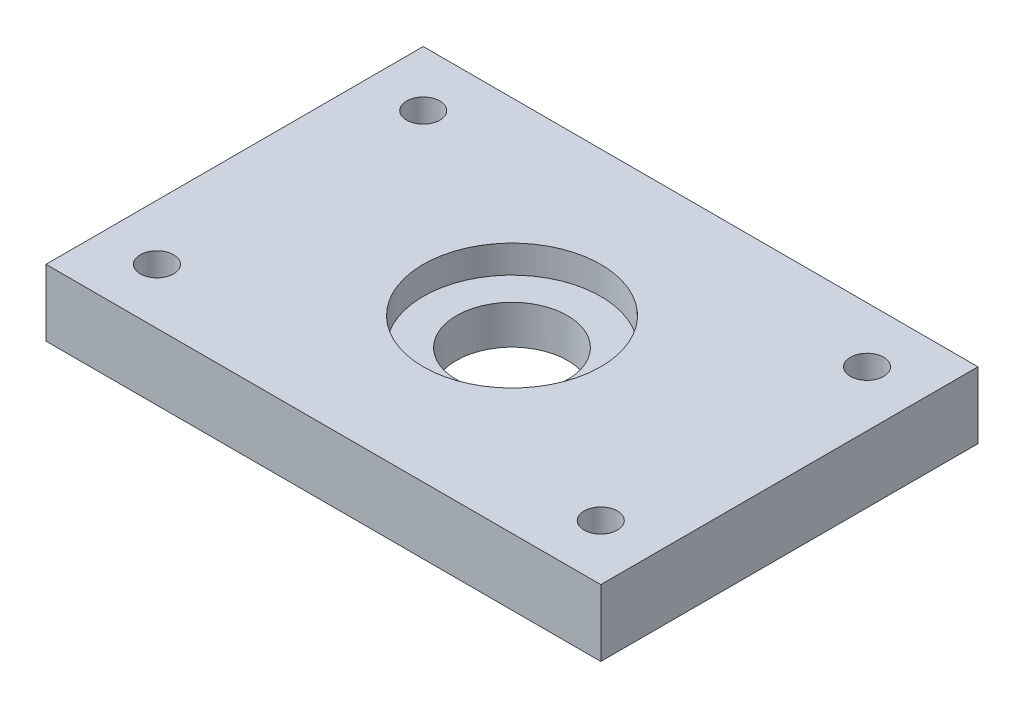
ISO-10303-21;
HEADER;
FILE_DESCRIPTION(('STEP AP214'),'2;1');
FILE_NAME('part.step','',(''),(''),'','','');
FILE_SCHEMA(('AUTOMOTIVE_DESIGN { 1 0 10303 214 1 1 1 1 }'));
ENDSEC;
DATA;
#1=APPLICATION_CONTEXT('core data for automotive mechanical design processes');
#2=APPLICATION_PROTOCOL_DEFINITION('international standard','automotive_design',2000,#1);
#3=PRODUCT_CONTEXT('',#1,'mechanical');
#4=PRODUCT('Part','Part','',(#3));
#5=PRODUCT_RELATED_PRODUCT_CATEGORY('part','',(#4));
#6=PRODUCT_DEFINITION_FORMATION('','',#4);
#7=PRODUCT_DEFINITION_CONTEXT('part definition',#1,'design');
#8=PRODUCT_DEFINITION('design','',#6,#7);
#9=PRODUCT_DEFINITION_SHAPE('','',#8);
#10=(LENGTH_UNIT() NAMED_UNIT(*) SI_UNIT(.MILLI.,.METRE.));
#11=(NAMED_UNIT(*) PLANE_ANGLE_UNIT() SI_UNIT($,.RADIAN.));
#12=(NAMED_UNIT(*) SI_UNIT($,.STERADIAN.) SOLID_ANGLE_UNIT());
#13=UNCERTAINTY_MEASURE_WITH_UNIT(LENGTH_MEASURE(1.E-05),#10,'distance_accuracy_value','');
#14=(GEOMETRIC_REPRESENTATION_CONTEXT(3) GLOBAL_UNCERTAINTY_ASSIGNED_CONTEXT((#13)) GLOBAL_UNIT_ASSIGNED_CONTEXT((#10,
#11,#12)) REPRESENTATION_CONTEXT('',''));
#15=CARTESIAN_POINT('',(0.,0.,0.));
#16=DIRECTION('',(0.,0.,1.));
#17=DIRECTION('',(1.,0.,0.));
#18=AXIS2_PLACEMENT_3D('',#15,#16,#17);
#19=CARTESIAN_POINT('',(0.,-14.142135623731,0.));
#20=DIRECTION('',(0.,1.,0.));
#21=DIRECTION('',(0.,0.,1.));
#22=AXIS2_PLACEMENT_3D('',#19,#20,#21);
#23=CYLINDRICAL_SURFACE('',#22,5.);
#24=CARTESIAN_POINT('',(0.,0.,0.));
#25=DIRECTION('',(0.,-1.,0.));
#26=DIRECTION('',(0.,0.,-1.));
#27=AXIS2_PLACEMENT_3D('',#24,#25,#26);
#28=CIRCLE('',#27,5.);
#29=CARTESIAN_POINT('',(0.,0.,-5.));
#30=VERTEX_POINT('',#29);
#31=EDGE_CURVE('E138',#30,#30,#28,.F.);
#32=ORIENTED_EDGE('',*,*,#31,.F.);
#33=EDGE_LOOP('',(#32));
#34=FACE_BOUND('',#33,.T.);
#35=CARTESIAN_POINT('',(0.,3.5,0.));
#36=DIRECTION('',(0.,1.,0.));
#37=DIRECTION('',(0.,0.,1.));
#38=AXIS2_PLACEMENT_3D('',#35,#36,#37);
#39=CIRCLE('',#38,5.);
#40=CARTESIAN_POINT('',(0.,3.5,5.));
#41=VERTEX_POINT('',#40);
#42=EDGE_CURVE('E39',#41,#41,#39,.F.);
#43=ORIENTED_EDGE('',*,*,#42,.F.);
#44=EDGE_LOOP('',(#43));
#45=FACE_BOUND('',#44,.T.);
#46=ADVANCED_FACE('F35',(#34,#45),#23,.F.);
#47=CARTESIAN_POINT('',(25.,6.,-17.));
#48=DIRECTION('',(-1.,0.,0.));
#49=DIRECTION('',(0.,0.,1.));
#50=AXIS2_PLACEMENT_3D('',#47,#48,#49);
#51=PLANE('',#50);
#52=DIRECTION('',(0.,0.,-1.));
#53=VECTOR('',#52,1.);
#54=CARTESIAN_POINT('',(25.,0.,-17.));
#55=LINE('',#54,#53);
#56=CARTESIAN_POINT('',(25.,0.,17.));
#57=VERTEX_POINT('',#56);
#58=CARTESIAN_POINT('',(25.,0.,-17.));
#59=VERTEX_POINT('',#58);
#60=EDGE_CURVE('E101',#57,#59,#55,.T.);
#61=ORIENTED_EDGE('',*,*,#60,.T.);
#62=DIRECTION('',(0.,-1.,0.));
#63=VECTOR('',#62,1.);
#64=CARTESIAN_POINT('',(25.,6.,-17.));
#65=LINE('',#64,#63);
#66=CARTESIAN_POINT('',(25.,6.,-17.));
#67=VERTEX_POINT('',#66);
#68=EDGE_CURVE('E11',#67,#59,#65,.T.);
#69=ORIENTED_EDGE('',*,*,#68,.F.);
#70=DIRECTION('',(0.,0.,-1.));
#71=VECTOR('',#70,1.);
#72=CARTESIAN_POINT('',(25.,6.,-17.));
#73=LINE('',#72,#71);
#74=CARTESIAN_POINT('',(25.,6.,17.));
#75=VERTEX_POINT('',#74);
#76=EDGE_CURVE('E88',#75,#67,#73,.T.);
#77=ORIENTED_EDGE('',*,*,#76,.F.);
#78=DIRECTION('',(0.,-1.,0.));
#79=VECTOR('',#78,1.);
#80=CARTESIAN_POINT('',(25.,6.,17.));
#81=LINE('',#80,#79);
#82=EDGE_CURVE('E97',#75,#57,#81,.T.);
#83=ORIENTED_EDGE('',*,*,#82,.T.);
#84=EDGE_LOOP('',(#61,#69,#77,#83));
#85=FACE_BOUND('',#84,.T.);
#86=ADVANCED_FACE('F37',(#85),#51,.F.);
#87=CARTESIAN_POINT('',(25.,6.,-17.));
#88=DIRECTION('',(0.,0.,1.));
#89=DIRECTION('',(1.,0.,0.));
#90=AXIS2_PLACEMENT_3D('',#87,#88,#89);
#91=PLANE('',#90);
#92=DIRECTION('',(-1.,0.,0.));
#93=VECTOR('',#92,1.);
#94=CARTESIAN_POINT('',(25.,0.,-17.));
#95=LINE('',#94,#93);
#96=CARTESIAN_POINT('',(-25.,0.,-17.));
#97=VERTEX_POINT('',#96);
#98=EDGE_CURVE('E92',#59,#97,#95,.T.);
#99=ORIENTED_EDGE('',*,*,#98,.T.);
#100=DIRECTION('',(0.,-1.,0.));
#101=VECTOR('',#100,1.);
#102=CARTESIAN_POINT('',(-25.,6.,-17.));
#103=LINE('',#102,#101);
#104=CARTESIAN_POINT('',(-25.,6.,-17.));
#105=VERTEX_POINT('',#104);
#106=EDGE_CURVE('E45',#105,#97,#103,.T.);
#107=ORIENTED_EDGE('',*,*,#106,.F.);
#108=DIRECTION('',(-1.,0.,0.));
#109=VECTOR('',#108,1.);
#110=CARTESIAN_POINT('',(25.,6.,-17.));
#111=LINE('',#110,#109);
#112=EDGE_CURVE('E83',#67,#105,#111,.T.);
#113=ORIENTED_EDGE('',*,*,#112,.F.);
#114=ORIENTED_EDGE('',*,*,#68,.T.);
#115=EDGE_LOOP('',(#99,#107,#113,#114));
#116=FACE_BOUND('',#115,.T.);
#117=ADVANCED_FACE('F91',(#116),#91,.F.);
#118=CARTESIAN_POINT('',(-25.,6.,-17.));
#119=DIRECTION('',(1.,0.,0.));
#120=DIRECTION('',(0.,0.,-1.));
#121=AXIS2_PLACEMENT_3D('',#118,#119,#120);
#122=PLANE('',#121);
#123=DIRECTION('',(0.,0.,1.));
#124=VECTOR('',#123,1.);
#125=CARTESIAN_POINT('',(-25.,0.,-17.));
#126=LINE('',#125,#124);
#127=CARTESIAN_POINT('',(-25.,0.,17.));
#128=VERTEX_POINT('',#127);
#129=EDGE_CURVE('E70',#97,#128,#126,.T.);
#130=ORIENTED_EDGE('',*,*,#129,.T.);
#131=DIRECTION('',(0.,-1.,0.));
#132=VECTOR('',#131,1.);
#133=CARTESIAN_POINT('',(-25.,6.,17.));
#134=LINE('',#133,#132);
#135=CARTESIAN_POINT('',(-25.,6.,17.));
#136=VERTEX_POINT('',#135);
#137=EDGE_CURVE('E93',#136,#128,#134,.T.);
#138=ORIENTED_EDGE('',*,*,#137,.F.);
#139=DIRECTION('',(0.,0.,1.));
#140=VECTOR('',#139,1.);
#141=CARTESIAN_POINT('',(-25.,6.,-17.));
#142=LINE('',#141,#140);
#143=EDGE_CURVE('E86',#105,#136,#142,.T.);
#144=ORIENTED_EDGE('',*,*,#143,.F.);
#145=ORIENTED_EDGE('',*,*,#106,.T.);
#146=EDGE_LOOP('',(#130,#138,#144,#145));
#147=FACE_BOUND('',#146,.T.);
#148=ADVANCED_FACE('F95',(#147),#122,.F.);
#149=CARTESIAN_POINT('',(25.,6.,17.));
#150=DIRECTION('',(0.,0.,-1.));
#151=DIRECTION('',(-1.,0.,0.));
#152=AXIS2_PLACEMENT_3D('',#149,#150,#151);
#153=PLANE('',#152);
#154=DIRECTION('',(1.,0.,0.));
#155=VECTOR('',#154,1.);
#156=CARTESIAN_POINT('',(25.,0.,17.));
#157=LINE('',#156,#155);
#158=EDGE_CURVE('E76',#128,#57,#157,.T.);
#159=ORIENTED_EDGE('',*,*,#158,.T.);
#160=ORIENTED_EDGE('',*,*,#82,.F.);
#161=DIRECTION('',(1.,0.,0.));
#162=VECTOR('',#161,1.);
#163=CARTESIAN_POINT('',(25.,6.,17.));
#164=LINE('',#163,#162);
#165=EDGE_CURVE('E53',#136,#75,#164,.T.);
#166=ORIENTED_EDGE('',*,*,#165,.F.);
#167=ORIENTED_EDGE('',*,*,#137,.T.);
#168=EDGE_LOOP('',(#159,#160,#166,#167));
#169=FACE_BOUND('',#168,.T.);
#170=ADVANCED_FACE('F109',(#169),#153,.F.);
#171=CARTESIAN_POINT('',(0.,6.,0.));
#172=DIRECTION('',(0.,-1.,0.));
#173=DIRECTION('',(0.,0.,-1.));
#174=AXIS2_PLACEMENT_3D('',#171,#172,#173);
#175=PLANE('',#174);
#176=CARTESIAN_POINT('',(0.,6.,0.));
#177=DIRECTION('',(0.,1.,0.));
#178=DIRECTION('',(0.,0.,1.));
#179=AXIS2_PLACEMENT_3D('',#176,#177,#178);
#180=CIRCLE('',#179,8.);
#181=CARTESIAN_POINT('',(0.,6.,8.));
#182=VERTEX_POINT('',#181);
#183=EDGE_CURVE('E141',#182,#182,#180,.T.);
#184=ORIENTED_EDGE('',*,*,#183,.F.);
#185=EDGE_LOOP('',(#184));
#186=FACE_BOUND('',#185,.T.);
#187=CARTESIAN_POINT('',(20.,6.,-12.));
#188=DIRECTION('',(0.,-1.,0.));
#189=DIRECTION('',(0.,0.,-1.));
#190=AXIS2_PLACEMENT_3D('',#187,#188,#189);
#191=CIRCLE('',#190,1.5);
#192=CARTESIAN_POINT('',(20.,6.,-13.5));
#193=VERTEX_POINT('',#192);
#194=EDGE_CURVE('E132',#193,#193,#191,.F.);
#195=ORIENTED_EDGE('',*,*,#194,.F.);
#196=EDGE_LOOP('',(#195));
#197=FACE_BOUND('',#196,.T.);
#198=CARTESIAN_POINT('',(-20.,6.,-12.));
#199=DIRECTION('',(0.,-1.,0.));
#200=DIRECTION('',(0.,0.,-1.));
#201=AXIS2_PLACEMENT_3D('',#198,#199,#200);
#202=CIRCLE('',#201,1.5);
#203=CARTESIAN_POINT('',(-20.,6.,-13.5));
#204=VERTEX_POINT('',#203);
#205=EDGE_CURVE('E126',#204,#204,#202,.F.);
#206=ORIENTED_EDGE('',*,*,#205,.F.);
#207=EDGE_LOOP('',(#206));
#208=FACE_BOUND('',#207,.T.);
#209=CARTESIAN_POINT('',(-20.,6.,12.));
#210=DIRECTION('',(0.,-1.,0.));
#211=DIRECTION('',(0.,0.,-1.));
#212=AXIS2_PLACEMENT_3D('',#209,#210,#211);
#213=CIRCLE('',#212,1.5);
#214=CARTESIAN_POINT('',(-20.,6.,10.5));
#215=VERTEX_POINT('',#214);
#216=EDGE_CURVE('E120',#215,#215,#213,.F.);
#217=ORIENTED_EDGE('',*,*,#216,.F.);
#218=EDGE_LOOP('',(#217));
#219=FACE_BOUND('',#218,.T.);
#220=CARTESIAN_POINT('',(20.,6.,12.));
#221=DIRECTION('',(0.,-1.,0.));
#222=DIRECTION('',(0.,0.,-1.));
#223=AXIS2_PLACEMENT_3D('',#220,#221,#222);
#224=CIRCLE('',#223,1.5);
#225=CARTESIAN_POINT('',(20.,6.,10.5));
#226=VERTEX_POINT('',#225);
#227=EDGE_CURVE('E104',#226,#226,#224,.F.);
#228=ORIENTED_EDGE('',*,*,#227,.F.);
#229=EDGE_LOOP('',(#228));
#230=FACE_BOUND('',#229,.T.);
#231=ORIENTED_EDGE('',*,*,#76,.T.);
#232=ORIENTED_EDGE('',*,*,#112,.T.);
#233=ORIENTED_EDGE('',*,*,#143,.T.);
#234=ORIENTED_EDGE('',*,*,#165,.T.);
#235=EDGE_LOOP('',(#231,#232,#233,#234));
#236=FACE_BOUND('',#235,.T.);
#237=ADVANCED_FACE('F84',(#186,#197,#208,#219,#230,#236),#175,.F.);
#238=CARTESIAN_POINT('',(0.,0.,0.));
#239=DIRECTION('',(0.,-1.,0.));
#240=DIRECTION('',(0.,0.,-1.));
#241=AXIS2_PLACEMENT_3D('',#238,#239,#240);
#242=PLANE('',#241);
#243=ORIENTED_EDGE('',*,*,#31,.T.);
#244=EDGE_LOOP('',(#243));
#245=FACE_BOUND('',#244,.T.);
#246=CARTESIAN_POINT('',(20.,0.,-12.));
#247=DIRECTION('',(0.,-1.,0.));
#248=DIRECTION('',(0.,0.,-1.));
#249=AXIS2_PLACEMENT_3D('',#246,#247,#248);
#250=CIRCLE('',#249,1.5);
#251=CARTESIAN_POINT('',(20.,0.,-13.5));
#252=VERTEX_POINT('',#251);
#253=EDGE_CURVE('E135',#252,#252,#250,.T.);
#254=ORIENTED_EDGE('',*,*,#253,.F.);
#255=EDGE_LOOP('',(#254));
#256=FACE_BOUND('',#255,.T.);
#257=CARTESIAN_POINT('',(-20.,0.,-12.));
#258=DIRECTION('',(0.,-1.,0.));
#259=DIRECTION('',(0.,0.,-1.));
#260=AXIS2_PLACEMENT_3D('',#257,#258,#259);
#261=CIRCLE('',#260,1.5);
#262=CARTESIAN_POINT('',(-20.,0.,-13.5));
#263=VERTEX_POINT('',#262);
#264=EDGE_CURVE('E129',#263,#263,#261,.T.);
#265=ORIENTED_EDGE('',*,*,#264,.F.);
#266=EDGE_LOOP('',(#265));
#267=FACE_BOUND('',#266,.T.);
#268=CARTESIAN_POINT('',(-20.,0.,12.));
#269=DIRECTION('',(0.,-1.,0.));
#270=DIRECTION('',(0.,0.,-1.));
#271=AXIS2_PLACEMENT_3D('',#268,#269,#270);
#272=CIRCLE('',#271,1.5);
#273=CARTESIAN_POINT('',(-20.,0.,10.5));
#274=VERTEX_POINT('',#273);
#275=EDGE_CURVE('E123',#274,#274,#272,.T.);
#276=ORIENTED_EDGE('',*,*,#275,.F.);
#277=EDGE_LOOP('',(#276));
#278=FACE_BOUND('',#277,.T.);
#279=CARTESIAN_POINT('',(20.,0.,12.));
#280=DIRECTION('',(0.,-1.,0.));
#281=DIRECTION('',(0.,0.,-1.));
#282=AXIS2_PLACEMENT_3D('',#279,#280,#281);
#283=CIRCLE('',#282,1.5);
#284=CARTESIAN_POINT('',(20.,0.,10.5));
#285=VERTEX_POINT('',#284);
#286=EDGE_CURVE('E117',#285,#285,#283,.T.);
#287=ORIENTED_EDGE('',*,*,#286,.F.);
#288=EDGE_LOOP('',(#287));
#289=FACE_BOUND('',#288,.T.);
#290=ORIENTED_EDGE('',*,*,#60,.F.);
#291=ORIENTED_EDGE('',*,*,#158,.F.);
#292=ORIENTED_EDGE('',*,*,#129,.F.);
#293=ORIENTED_EDGE('',*,*,#98,.F.);
#294=EDGE_LOOP('',(#290,#291,#292,#293));
#295=FACE_BOUND('',#294,.T.);
#296=ADVANCED_FACE('F112',(#245,#256,#267,#278,#289,#295),#242,.T.);
#297=CARTESIAN_POINT('',(20.,10.2426406871193,12.));
#298=DIRECTION('',(0.,-1.,0.));
#299=DIRECTION('',(0.,0.,-1.));
#300=AXIS2_PLACEMENT_3D('',#297,#298,#299);
#301=CYLINDRICAL_SURFACE('',#300,1.5);
#302=ORIENTED_EDGE('',*,*,#227,.T.);
#303=EDGE_LOOP('',(#302));
#304=FACE_BOUND('',#303,.T.);
#305=ORIENTED_EDGE('',*,*,#286,.T.);
#306=EDGE_LOOP('',(#305));
#307=FACE_BOUND('',#306,.T.);
#308=ADVANCED_FACE('F175',(#304,#307),#301,.F.);
#309=CARTESIAN_POINT('',(-20.,10.2426406871193,12.));
#310=DIRECTION('',(0.,-1.,0.));
#311=DIRECTION('',(0.,0.,-1.));
#312=AXIS2_PLACEMENT_3D('',#309,#310,#311);
#313=CYLINDRICAL_SURFACE('',#312,1.5);
#314=ORIENTED_EDGE('',*,*,#216,.T.);
#315=EDGE_LOOP('',(#314));
#316=FACE_BOUND('',#315,.T.);
#317=ORIENTED_EDGE('',*,*,#275,.T.);
#318=EDGE_LOOP('',(#317));
#319=FACE_BOUND('',#318,.T.);
#320=ADVANCED_FACE('F171',(#316,#319),#313,.F.);
#321=CARTESIAN_POINT('',(-20.,10.2426406871193,-12.));
#322=DIRECTION('',(0.,-1.,0.));
#323=DIRECTION('',(0.,0.,-1.));
#324=AXIS2_PLACEMENT_3D('',#321,#322,#323);
#325=CYLINDRICAL_SURFACE('',#324,1.5);
#326=ORIENTED_EDGE('',*,*,#205,.T.);
#327=EDGE_LOOP('',(#326));
#328=FACE_BOUND('',#327,.T.);
#329=ORIENTED_EDGE('',*,*,#264,.T.);
#330=EDGE_LOOP('',(#329));
#331=FACE_BOUND('',#330,.T.);
#332=ADVANCED_FACE('F167',(#328,#331),#325,.F.);
#333=CARTESIAN_POINT('',(20.,10.2426406871193,-12.));
#334=DIRECTION('',(0.,-1.,0.));
#335=DIRECTION('',(0.,0.,-1.));
#336=AXIS2_PLACEMENT_3D('',#333,#334,#335);
#337=CYLINDRICAL_SURFACE('',#336,1.5);
#338=ORIENTED_EDGE('',*,*,#194,.T.);
#339=EDGE_LOOP('',(#338));
#340=FACE_BOUND('',#339,.T.);
#341=ORIENTED_EDGE('',*,*,#253,.T.);
#342=EDGE_LOOP('',(#341));
#343=FACE_BOUND('',#342,.T.);
#344=ADVANCED_FACE('F164',(#340,#343),#337,.F.);
#345=CARTESIAN_POINT('',(0.,3.5,0.));
#346=DIRECTION('',(0.,1.,0.));
#347=DIRECTION('',(0.,0.,1.));
#348=AXIS2_PLACEMENT_3D('',#345,#346,#347);
#349=PLANE('',#348);
#350=CARTESIAN_POINT('',(0.,3.5,0.));
#351=DIRECTION('',(0.,1.,0.));
#352=DIRECTION('',(0.,0.,1.));
#353=AXIS2_PLACEMENT_3D('',#350,#351,#352);
#354=CIRCLE('',#353,8.);
#355=CARTESIAN_POINT('',(0.,3.5,8.));
#356=VERTEX_POINT('',#355);
#357=EDGE_CURVE('E144',#356,#356,#354,.T.);
#358=ORIENTED_EDGE('',*,*,#357,.T.);
#359=EDGE_LOOP('',(#358));
#360=FACE_BOUND('',#359,.T.);
#361=ORIENTED_EDGE('',*,*,#42,.T.);
#362=EDGE_LOOP('',(#361));
#363=FACE_BOUND('',#362,.T.);
#364=ADVANCED_FACE('F151',(#360,#363),#349,.T.);
#365=CARTESIAN_POINT('',(0.,3.5,0.));
#366=DIRECTION('',(0.,1.,0.));
#367=DIRECTION('',(0.,0.,1.));
#368=AXIS2_PLACEMENT_3D('',#365,#366,#367);
#369=CYLINDRICAL_SURFACE('',#368,8.);
#370=ORIENTED_EDGE('',*,*,#357,.F.);
#371=EDGE_LOOP('',(#370));
#372=FACE_BOUND('',#371,.T.);
#373=ORIENTED_EDGE('',*,*,#183,.T.);
#374=EDGE_LOOP('',(#373));
#375=FACE_BOUND('',#374,.T.);
#376=ADVANCED_FACE('F162',(#372,#375),#369,.F.);
#377=CLOSED_SHELL('',(#46,#86,#117,#148,#170,#237,#296,#308,#320,#332,#344,#364,#376));
#378=MANIFOLD_SOLID_BREP('B2',#377);
#379=ADVANCED_BREP_SHAPE_REPRESENTATION('',(#18,#378),#14);
#380=SHAPE_DEFINITION_REPRESENTATION(#9,#379);
ENDSEC;
END-ISO-10303-21;
